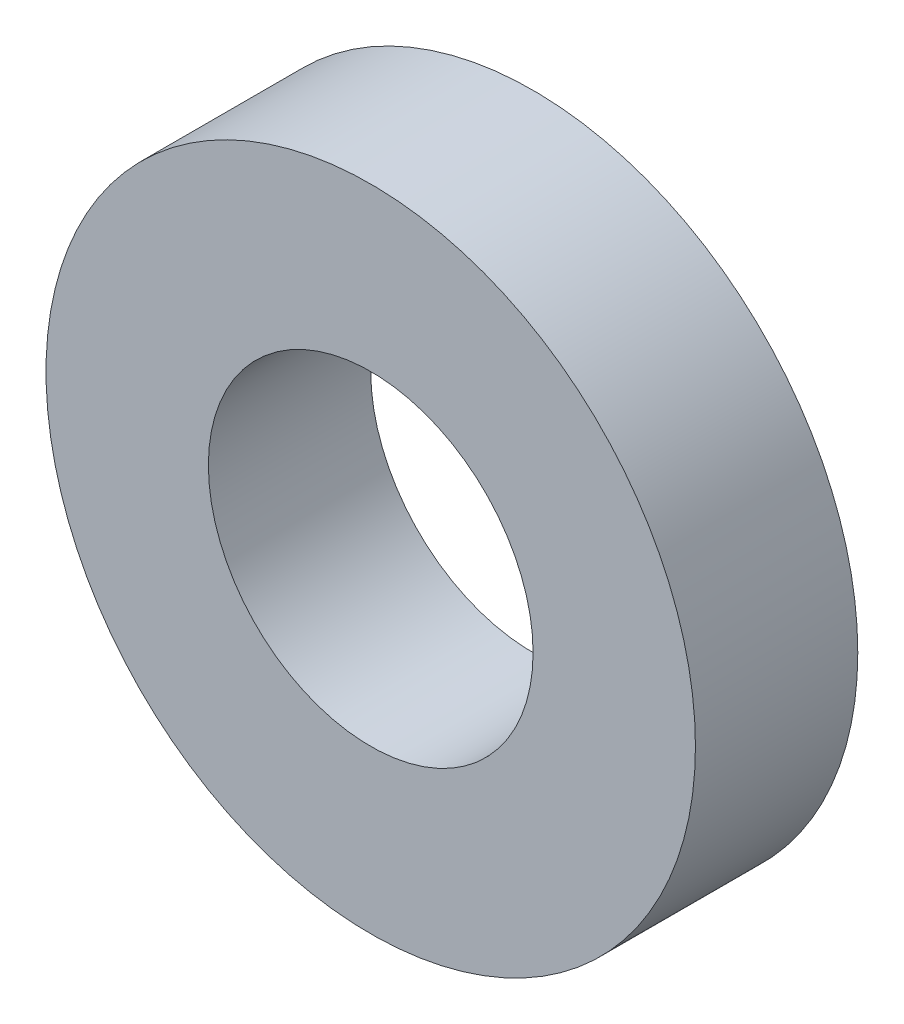
ISO-10303-21;
HEADER;
FILE_DESCRIPTION(('STEP AP214'),'2;1');
FILE_NAME('part.step','',(''),(''),'','','');
FILE_SCHEMA(('AUTOMOTIVE_DESIGN { 1 0 10303 214 1 1 1 1 }'));
ENDSEC;
DATA;
#1=APPLICATION_CONTEXT('core data for automotive mechanical design processes');
#2=APPLICATION_PROTOCOL_DEFINITION('international standard','automotive_design',2000,#1);
#3=PRODUCT_CONTEXT('',#1,'mechanical');
#4=PRODUCT('Part','Part','',(#3));
#5=PRODUCT_RELATED_PRODUCT_CATEGORY('part','',(#4));
#6=PRODUCT_DEFINITION_FORMATION('','',#4);
#7=PRODUCT_DEFINITION_CONTEXT('part definition',#1,'design');
#8=PRODUCT_DEFINITION('design','',#6,#7);
#9=PRODUCT_DEFINITION_SHAPE('','',#8);
#10=(LENGTH_UNIT() NAMED_UNIT(*) SI_UNIT(.MILLI.,.METRE.));
#11=(NAMED_UNIT(*) PLANE_ANGLE_UNIT() SI_UNIT($,.RADIAN.));
#12=(NAMED_UNIT(*) SI_UNIT($,.STERADIAN.) SOLID_ANGLE_UNIT());
#13=UNCERTAINTY_MEASURE_WITH_UNIT(LENGTH_MEASURE(1.E-05),#10,'distance_accuracy_value','');
#14=(GEOMETRIC_REPRESENTATION_CONTEXT(3) GLOBAL_UNCERTAINTY_ASSIGNED_CONTEXT((#13)) GLOBAL_UNIT_ASSIGNED_CONTEXT((#10,
#11,#12)) REPRESENTATION_CONTEXT('',''));
#15=CARTESIAN_POINT('',(0.,0.,0.));
#16=DIRECTION('',(0.,0.,1.));
#17=DIRECTION('',(1.,0.,0.));
#18=AXIS2_PLACEMENT_3D('',#15,#16,#17);
#19=CARTESIAN_POINT('',(0.,0.,12.7));
#20=DIRECTION('',(0.,0.,1.));
#21=DIRECTION('',(1.,0.,0.));
#22=AXIS2_PLACEMENT_3D('',#19,#20,#21);
#23=PLANE('',#22);
#24=CARTESIAN_POINT('',(0.,0.,12.7));
#25=DIRECTION('',(0.,0.,1.));
#26=DIRECTION('',(1.,0.,0.));
#27=AXIS2_PLACEMENT_3D('',#24,#25,#26);
#28=CIRCLE('',#27,25.4);
#29=CARTESIAN_POINT('',(25.4,0.,12.7));
#30=VERTEX_POINT('',#29);
#31=EDGE_CURVE('E10',#30,#30,#28,.T.);
#32=ORIENTED_EDGE('',*,*,#31,.T.);
#33=EDGE_LOOP('',(#32));
#34=FACE_BOUND('',#33,.T.);
#35=CARTESIAN_POINT('',(0.,0.,12.7));
#36=DIRECTION('',(0.,0.,1.));
#37=DIRECTION('',(1.,0.,0.));
#38=AXIS2_PLACEMENT_3D('',#35,#36,#37);
#39=CIRCLE('',#38,12.7);
#40=CARTESIAN_POINT('',(12.7,0.,12.7));
#41=VERTEX_POINT('',#40);
#42=EDGE_CURVE('E41',#41,#41,#39,.T.);
#43=ORIENTED_EDGE('',*,*,#42,.F.);
#44=EDGE_LOOP('',(#43));
#45=FACE_BOUND('',#44,.T.);
#46=ADVANCED_FACE('F30',(#34,#45),#23,.T.);
#47=CARTESIAN_POINT('',(0.,0.,0.));
#48=DIRECTION('',(0.,0.,1.));
#49=DIRECTION('',(1.,0.,0.));
#50=AXIS2_PLACEMENT_3D('',#47,#48,#49);
#51=PLANE('',#50);
#52=CARTESIAN_POINT('',(0.,0.,0.));
#53=DIRECTION('',(0.,0.,1.));
#54=DIRECTION('',(1.,0.,0.));
#55=AXIS2_PLACEMENT_3D('',#52,#53,#54);
#56=CIRCLE('',#55,25.4);
#57=CARTESIAN_POINT('',(25.4,0.,0.));
#58=VERTEX_POINT('',#57);
#59=EDGE_CURVE('E34',#58,#58,#56,.T.);
#60=ORIENTED_EDGE('',*,*,#59,.F.);
#61=EDGE_LOOP('',(#60));
#62=FACE_BOUND('',#61,.T.);
#63=CARTESIAN_POINT('',(0.,0.,0.));
#64=DIRECTION('',(0.,0.,1.));
#65=DIRECTION('',(1.,0.,0.));
#66=AXIS2_PLACEMENT_3D('',#63,#64,#65);
#67=CIRCLE('',#66,12.7);
#68=CARTESIAN_POINT('',(12.7,0.,0.));
#69=VERTEX_POINT('',#68);
#70=EDGE_CURVE('E43',#69,#69,#67,.T.);
#71=ORIENTED_EDGE('',*,*,#70,.T.);
#72=EDGE_LOOP('',(#71));
#73=FACE_BOUND('',#72,.T.);
#74=ADVANCED_FACE('F53',(#62,#73),#51,.F.);
#75=CARTESIAN_POINT('',(0.,0.,12.7));
#76=DIRECTION('',(0.,0.,-1.));
#77=DIRECTION('',(-1.,0.,0.));
#78=AXIS2_PLACEMENT_3D('',#75,#76,#77);
#79=CYLINDRICAL_SURFACE('',#78,25.4);
#80=ORIENTED_EDGE('',*,*,#31,.F.);
#81=EDGE_LOOP('',(#80));
#82=FACE_BOUND('',#81,.T.);
#83=ORIENTED_EDGE('',*,*,#59,.T.);
#84=EDGE_LOOP('',(#83));
#85=FACE_BOUND('',#84,.T.);
#86=ADVANCED_FACE('F32',(#82,#85),#79,.T.);
#87=CARTESIAN_POINT('',(0.,0.,12.7));
#88=DIRECTION('',(0.,0.,-1.));
#89=DIRECTION('',(-1.,0.,0.));
#90=AXIS2_PLACEMENT_3D('',#87,#88,#89);
#91=CYLINDRICAL_SURFACE('',#90,12.7);
#92=ORIENTED_EDGE('',*,*,#42,.T.);
#93=EDGE_LOOP('',(#92));
#94=FACE_BOUND('',#93,.T.);
#95=ORIENTED_EDGE('',*,*,#70,.F.);
#96=EDGE_LOOP('',(#95));
#97=FACE_BOUND('',#96,.T.);
#98=ADVANCED_FACE('F49',(#94,#97),#91,.F.);
#99=CLOSED_SHELL('',(#46,#74,#86,#98));
#100=MANIFOLD_SOLID_BREP('B2',#99);
#101=ADVANCED_BREP_SHAPE_REPRESENTATION('',(#18,#100),#14);
#102=SHAPE_DEFINITION_REPRESENTATION(#9,#101);
ENDSEC;
END-ISO-10303-21;
